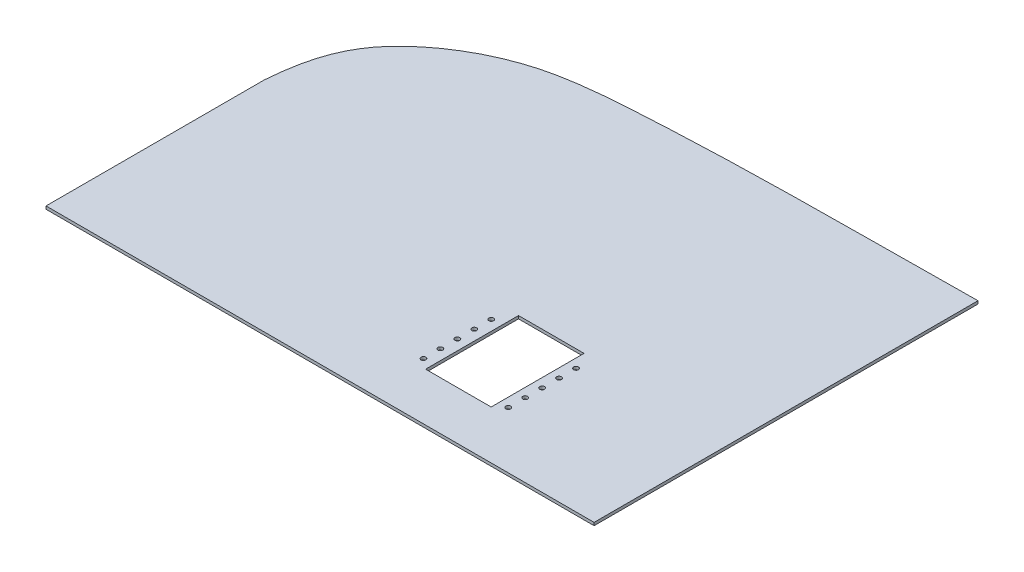
ISO-10303-21;
HEADER;
FILE_DESCRIPTION(('STEP AP214'),'2;1');
FILE_NAME('part.step','',(''),(''),'','','');
FILE_SCHEMA(('AUTOMOTIVE_DESIGN { 1 0 10303 214 1 1 1 1 }'));
ENDSEC;
DATA;
#1=APPLICATION_CONTEXT('core data for automotive mechanical design processes');
#2=APPLICATION_PROTOCOL_DEFINITION('international standard','automotive_design',2000,#1);
#3=PRODUCT_CONTEXT('',#1,'mechanical');
#4=PRODUCT('Part','Part','',(#3));
#5=PRODUCT_RELATED_PRODUCT_CATEGORY('part','',(#4));
#6=PRODUCT_DEFINITION_FORMATION('','',#4);
#7=PRODUCT_DEFINITION_CONTEXT('part definition',#1,'design');
#8=PRODUCT_DEFINITION('design','',#6,#7);
#9=PRODUCT_DEFINITION_SHAPE('','',#8);
#10=(LENGTH_UNIT() NAMED_UNIT(*) SI_UNIT(.MILLI.,.METRE.));
#11=(NAMED_UNIT(*) PLANE_ANGLE_UNIT() SI_UNIT($,.RADIAN.));
#12=(NAMED_UNIT(*) SI_UNIT($,.STERADIAN.) SOLID_ANGLE_UNIT());
#13=UNCERTAINTY_MEASURE_WITH_UNIT(LENGTH_MEASURE(1.E-05),#10,'distance_accuracy_value','');
#14=(GEOMETRIC_REPRESENTATION_CONTEXT(3) GLOBAL_UNCERTAINTY_ASSIGNED_CONTEXT((#13)) GLOBAL_UNIT_ASSIGNED_CONTEXT((#10,
#11,#12)) REPRESENTATION_CONTEXT('',''));
#15=CARTESIAN_POINT('',(0.,0.,0.));
#16=DIRECTION('',(0.,0.,1.));
#17=DIRECTION('',(1.,0.,0.));
#18=AXIS2_PLACEMENT_3D('',#15,#16,#17);
#19=CARTESIAN_POINT('',(76.0407582658623,2.4,-315.43813256716));
#20=DIRECTION('',(0.,1.,0.));
#21=DIRECTION('',(0.,0.,1.));
#22=AXIS2_PLACEMENT_3D('',#19,#20,#21);
#23=PLANE('',#22);
#24=CARTESIAN_POINT('',(38.6790277233677,2.4,-60.7));
#25=DIRECTION('',(0.,1.,0.));
#26=DIRECTION('',(0.,0.,1.));
#27=AXIS2_PLACEMENT_3D('',#24,#25,#26);
#28=CIRCLE('',#27,2.);
#29=CARTESIAN_POINT('',(38.6790277233677,2.4,-58.7));
#30=VERTEX_POINT('',#29);
#31=EDGE_CURVE('E251',#30,#30,#28,.T.);
#32=ORIENTED_EDGE('',*,*,#31,.F.);
#33=EDGE_LOOP('',(#32));
#34=FACE_BOUND('',#33,.T.);
#35=CARTESIAN_POINT('',(38.6790277233674,2.4,-88.7));
#36=DIRECTION('',(0.,1.,0.));
#37=DIRECTION('',(0.,0.,1.));
#38=AXIS2_PLACEMENT_3D('',#35,#36,#37);
#39=CIRCLE('',#38,2.);
#40=CARTESIAN_POINT('',(38.6790277233674,2.4,-86.7));
#41=VERTEX_POINT('',#40);
#42=EDGE_CURVE('E263',#41,#41,#39,.T.);
#43=ORIENTED_EDGE('',*,*,#42,.F.);
#44=EDGE_LOOP('',(#43));
#45=FACE_BOUND('',#44,.T.);
#46=CARTESIAN_POINT('',(108.679027723368,2.4,-60.7));
#47=DIRECTION('',(0.,1.,0.));
#48=DIRECTION('',(0.,0.,1.));
#49=AXIS2_PLACEMENT_3D('',#46,#47,#48);
#50=CIRCLE('',#49,2.00000000000001);
#51=CARTESIAN_POINT('',(108.679027723368,2.4,-58.7));
#52=VERTEX_POINT('',#51);
#53=EDGE_CURVE('E275',#52,#52,#50,.T.);
#54=ORIENTED_EDGE('',*,*,#53,.F.);
#55=EDGE_LOOP('',(#54));
#56=FACE_BOUND('',#55,.T.);
#57=CARTESIAN_POINT('',(108.679027723367,2.4,-88.7));
#58=DIRECTION('',(0.,1.,0.));
#59=DIRECTION('',(0.,0.,1.));
#60=AXIS2_PLACEMENT_3D('',#57,#58,#59);
#61=CIRCLE('',#60,2.);
#62=CARTESIAN_POINT('',(108.679027723367,2.4,-86.7));
#63=VERTEX_POINT('',#62);
#64=EDGE_CURVE('E287',#63,#63,#61,.T.);
#65=ORIENTED_EDGE('',*,*,#64,.F.);
#66=EDGE_LOOP('',(#65));
#67=FACE_BOUND('',#66,.T.);
#68=CARTESIAN_POINT('',(38.6790277233673,2.4,-102.7));
#69=DIRECTION('',(0.,1.,0.));
#70=DIRECTION('',(0.,0.,1.));
#71=AXIS2_PLACEMENT_3D('',#68,#69,#70);
#72=CIRCLE('',#71,2.);
#73=CARTESIAN_POINT('',(38.6790277233673,2.4,-100.7));
#74=VERTEX_POINT('',#73);
#75=EDGE_CURVE('E137',#74,#74,#72,.T.);
#76=ORIENTED_EDGE('',*,*,#75,.F.);
#77=EDGE_LOOP('',(#76));
#78=FACE_BOUND('',#77,.T.);
#79=DIRECTION('',(0.,0.,-1.));
#80=VECTOR('',#79,1.);
#81=CARTESIAN_POINT('',(226.279027723367,2.4,0.));
#82=LINE('',#81,#80);
#83=CARTESIAN_POINT('',(226.279027723367,2.4,0.));
#84=VERTEX_POINT('',#83);
#85=CARTESIAN_POINT('',(226.279027723367,2.4,-317.));
#86=VERTEX_POINT('',#85);
#87=EDGE_CURVE('E147',#84,#86,#82,.T.);
#88=ORIENTED_EDGE('',*,*,#87,.T.);
#89=CARTESIAN_POINT('',(226.279027723367,2.4,-317.));
#90=CARTESIAN_POINT('',(126.058596010829,2.4,-315.530489859332));
#91=CARTESIAN_POINT('',(25.9570834570145,2.4,-316.912644390666));
#92=CARTESIAN_POINT('',(-74.,2.4,-309.175657787283));
#93=B_SPLINE_CURVE_WITH_KNOTS('',3,(#89,#90,#91,#92),.UNSPECIFIED.,.F.,.F.,(4,4),(0.,1.),.UNSPECIFIED.);
#94=CARTESIAN_POINT('',(-74.,2.4,-309.175657787283));
#95=VERTEX_POINT('',#94);
#96=EDGE_CURVE('E150',#86,#95,#93,.T.);
#97=ORIENTED_EDGE('',*,*,#96,.T.);
#98=CARTESIAN_POINT('',(-74.,2.4,-309.175657787283));
#99=CARTESIAN_POINT('',(-89.4215417439998,2.4,-307.637409523307));
#100=CARTESIAN_POINT('',(-113.067752707542,2.4,-305.047150569867));
#101=CARTESIAN_POINT('',(-156.350341436039,2.4,-289.269961957736));
#102=CARTESIAN_POINT('',(-180.591001989476,2.4,-273.897889752811));
#103=CARTESIAN_POINT('',(-213.411911355581,2.4,-241.728935898293));
#104=CARTESIAN_POINT('',(-223.667205931551,2.4,-215.476583648526));
#105=CARTESIAN_POINT('',(-226.279027723367,2.4,-180.));
#106=B_SPLINE_CURVE_WITH_KNOTS('',3,(#98,#99,#100,#101,#102,#103,#104,#105),.UNSPECIFIED.,.F.,
.F.,(4,1,1,1,1,4),(0.,0.252038298692755,0.31225331059805,0.569939362557962,0.641935107147655,
1.),.UNSPECIFIED.);
#107=CARTESIAN_POINT('',(-226.279027723367,2.4,-180.));
#108=VERTEX_POINT('',#107);
#109=EDGE_CURVE('E156',#95,#108,#106,.T.);
#110=ORIENTED_EDGE('',*,*,#109,.T.);
#111=DIRECTION('',(0.,0.,1.));
#112=VECTOR('',#111,1.);
#113=CARTESIAN_POINT('',(-226.279027723367,2.4,0.));
#114=LINE('',#113,#112);
#115=CARTESIAN_POINT('',(-226.279027723367,2.4,0.));
#116=VERTEX_POINT('',#115);
#117=EDGE_CURVE('E349',#108,#116,#114,.T.);
#118=ORIENTED_EDGE('',*,*,#117,.T.);
#119=DIRECTION('',(1.,0.,0.));
#120=VECTOR('',#119,1.);
#121=CARTESIAN_POINT('',(-226.279027723367,2.4,0.));
#122=LINE('',#121,#120);
#123=EDGE_CURVE('E335',#116,#84,#122,.T.);
#124=ORIENTED_EDGE('',*,*,#123,.T.);
#125=EDGE_LOOP('',(#88,#97,#110,#118,#124));
#126=FACE_BOUND('',#125,.T.);
#127=DIRECTION('',(1.,0.,0.));
#128=VECTOR('',#127,1.);
#129=CARTESIAN_POINT('',(47.1790277233673,2.4,-40.));
#130=LINE('',#129,#128);
#131=CARTESIAN_POINT('',(47.1790277233673,2.4,-40.));
#132=VERTEX_POINT('',#131);
#133=CARTESIAN_POINT('',(101.279027723367,2.4,-40.));
#134=VERTEX_POINT('',#133);
#135=EDGE_CURVE('E116',#132,#134,#130,.T.);
#136=ORIENTED_EDGE('',*,*,#135,.F.);
#137=DIRECTION('',(0.,0.,1.));
#138=VECTOR('',#137,1.);
#139=CARTESIAN_POINT('',(47.1790277233673,2.4,-40.));
#140=LINE('',#139,#138);
#141=CARTESIAN_POINT('',(47.1790277233673,2.4,-116.7));
#142=VERTEX_POINT('',#141);
#143=EDGE_CURVE('E108',#142,#132,#140,.T.);
#144=ORIENTED_EDGE('',*,*,#143,.F.);
#145=DIRECTION('',(-1.,0.,0.));
#146=VECTOR('',#145,1.);
#147=CARTESIAN_POINT('',(47.1790277233673,2.4,-116.7));
#148=LINE('',#147,#146);
#149=CARTESIAN_POINT('',(101.279027723367,2.4,-116.7));
#150=VERTEX_POINT('',#149);
#151=EDGE_CURVE('E131',#150,#142,#148,.T.);
#152=ORIENTED_EDGE('',*,*,#151,.F.);
#153=DIRECTION('',(0.,0.,-1.));
#154=VECTOR('',#153,1.);
#155=CARTESIAN_POINT('',(101.279027723367,2.4,-40.));
#156=LINE('',#155,#154);
#157=EDGE_CURVE('E129',#134,#150,#156,.T.);
#158=ORIENTED_EDGE('',*,*,#157,.F.);
#159=EDGE_LOOP('',(#136,#144,#152,#158));
#160=FACE_BOUND('',#159,.T.);
#161=CARTESIAN_POINT('',(108.679027723367,2.4,-102.7));
#162=DIRECTION('',(0.,1.,0.));
#163=DIRECTION('',(0.,0.,1.));
#164=AXIS2_PLACEMENT_3D('',#161,#162,#163);
#165=CIRCLE('',#164,2.00000000000001);
#166=CARTESIAN_POINT('',(108.679027723367,2.4,-100.7));
#167=VERTEX_POINT('',#166);
#168=EDGE_CURVE('E293',#167,#167,#165,.T.);
#169=ORIENTED_EDGE('',*,*,#168,.F.);
#170=EDGE_LOOP('',(#169));
#171=FACE_BOUND('',#170,.T.);
#172=CARTESIAN_POINT('',(108.679027723368,2.4,-74.7));
#173=DIRECTION('',(0.,1.,0.));
#174=DIRECTION('',(0.,0.,1.));
#175=AXIS2_PLACEMENT_3D('',#172,#173,#174);
#176=CIRCLE('',#175,2.);
#177=CARTESIAN_POINT('',(108.679027723368,2.4,-72.7));
#178=VERTEX_POINT('',#177);
#179=EDGE_CURVE('E281',#178,#178,#176,.T.);
#180=ORIENTED_EDGE('',*,*,#179,.F.);
#181=EDGE_LOOP('',(#180));
#182=FACE_BOUND('',#181,.T.);
#183=CARTESIAN_POINT('',(108.679027723368,2.4,-46.7));
#184=DIRECTION('',(0.,1.,0.));
#185=DIRECTION('',(0.,0.,1.));
#186=AXIS2_PLACEMENT_3D('',#183,#184,#185);
#187=CIRCLE('',#186,2.00000000000001);
#188=CARTESIAN_POINT('',(108.679027723368,2.4,-44.7));
#189=VERTEX_POINT('',#188);
#190=EDGE_CURVE('E269',#189,#189,#187,.T.);
#191=ORIENTED_EDGE('',*,*,#190,.F.);
#192=EDGE_LOOP('',(#191));
#193=FACE_BOUND('',#192,.T.);
#194=CARTESIAN_POINT('',(38.6790277233676,2.4,-74.7));
#195=DIRECTION('',(0.,1.,0.));
#196=DIRECTION('',(0.,0.,1.));
#197=AXIS2_PLACEMENT_3D('',#194,#195,#196);
#198=CIRCLE('',#197,2.);
#199=CARTESIAN_POINT('',(38.6790277233676,2.4,-72.7));
#200=VERTEX_POINT('',#199);
#201=EDGE_CURVE('E257',#200,#200,#198,.T.);
#202=ORIENTED_EDGE('',*,*,#201,.F.);
#203=EDGE_LOOP('',(#202));
#204=FACE_BOUND('',#203,.T.);
#205=CARTESIAN_POINT('',(38.6790277233679,2.4,-46.7));
#206=DIRECTION('',(0.,1.,0.));
#207=DIRECTION('',(0.,0.,1.));
#208=AXIS2_PLACEMENT_3D('',#205,#206,#207);
#209=CIRCLE('',#208,2.);
#210=CARTESIAN_POINT('',(38.6790277233679,2.4,-44.7));
#211=VERTEX_POINT('',#210);
#212=EDGE_CURVE('E242',#211,#211,#209,.T.);
#213=ORIENTED_EDGE('',*,*,#212,.F.);
#214=EDGE_LOOP('',(#213));
#215=FACE_BOUND('',#214,.T.);
#216=ADVANCED_FACE('F37',(#34,#45,#56,#67,#78,#126,#160,#171,#182,#193,#204,#215),#23,.T.);
#217=CARTESIAN_POINT('',(76.0407582658623,0.,-315.43813256716));
#218=DIRECTION('',(0.,1.,0.));
#219=DIRECTION('',(0.,0.,1.));
#220=AXIS2_PLACEMENT_3D('',#217,#218,#219);
#221=PLANE('',#220);
#222=DIRECTION('',(0.,0.,-1.));
#223=VECTOR('',#222,1.);
#224=CARTESIAN_POINT('',(226.279027723367,0.,0.));
#225=LINE('',#224,#223);
#226=CARTESIAN_POINT('',(226.279027723367,0.,0.));
#227=VERTEX_POINT('',#226);
#228=CARTESIAN_POINT('',(226.279027723367,0.,-317.));
#229=VERTEX_POINT('',#228);
#230=EDGE_CURVE('E124',#227,#229,#225,.T.);
#231=ORIENTED_EDGE('',*,*,#230,.F.);
#232=DIRECTION('',(1.,0.,0.));
#233=VECTOR('',#232,1.);
#234=CARTESIAN_POINT('',(-226.279027723367,0.,0.));
#235=LINE('',#234,#233);
#236=CARTESIAN_POINT('',(-226.279027723367,0.,0.));
#237=VERTEX_POINT('',#236);
#238=EDGE_CURVE('E151',#237,#227,#235,.T.);
#239=ORIENTED_EDGE('',*,*,#238,.F.);
#240=DIRECTION('',(0.,0.,1.));
#241=VECTOR('',#240,1.);
#242=CARTESIAN_POINT('',(-226.279027723367,0.,0.));
#243=LINE('',#242,#241);
#244=CARTESIAN_POINT('',(-226.279027723367,0.,-180.));
#245=VERTEX_POINT('',#244);
#246=EDGE_CURVE('E365',#245,#237,#243,.T.);
#247=ORIENTED_EDGE('',*,*,#246,.F.);
#248=CARTESIAN_POINT('',(-74.,0.,-309.175657787283));
#249=CARTESIAN_POINT('',(-89.4215417439998,0.,-307.637409523307));
#250=CARTESIAN_POINT('',(-113.067752707542,0.,-305.047150569867));
#251=CARTESIAN_POINT('',(-156.350341436039,0.,-289.269961957736));
#252=CARTESIAN_POINT('',(-180.591001989476,0.,-273.897889752811));
#253=CARTESIAN_POINT('',(-213.411911355581,0.,-241.728935898293));
#254=CARTESIAN_POINT('',(-223.667205931551,0.,-215.476583648526));
#255=CARTESIAN_POINT('',(-226.279027723367,0.,-180.));
#256=B_SPLINE_CURVE_WITH_KNOTS('',3,(#248,#249,#250,#251,#252,#253,#254,#255),.UNSPECIFIED.,.F.,
.F.,(4,1,1,1,1,4),(0.,0.252038298692755,0.31225331059805,0.569939362557962,0.641935107147655,
1.),.UNSPECIFIED.);
#257=CARTESIAN_POINT('',(-74.,0.,-309.175657787283));
#258=VERTEX_POINT('',#257);
#259=EDGE_CURVE('E358',#258,#245,#256,.T.);
#260=ORIENTED_EDGE('',*,*,#259,.F.);
#261=CARTESIAN_POINT('',(226.279027723367,0.,-317.));
#262=CARTESIAN_POINT('',(126.058596010829,0.,-315.530489859332));
#263=CARTESIAN_POINT('',(25.9570834570145,0.,-316.912644390666));
#264=CARTESIAN_POINT('',(-74.,0.,-309.175657787283));
#265=B_SPLINE_CURVE_WITH_KNOTS('',3,(#261,#262,#263,#264),.UNSPECIFIED.,.F.,.F.,(4,4),(0.,1.),.UNSPECIFIED.);
#266=EDGE_CURVE('E341',#229,#258,#265,.T.);
#267=ORIENTED_EDGE('',*,*,#266,.F.);
#268=EDGE_LOOP('',(#231,#239,#247,#260,#267));
#269=FACE_BOUND('',#268,.T.);
#270=DIRECTION('',(0.,0.,1.));
#271=VECTOR('',#270,1.);
#272=CARTESIAN_POINT('',(47.1790277233673,0.,-40.));
#273=LINE('',#272,#271);
#274=CARTESIAN_POINT('',(47.1790277233673,0.,-116.7));
#275=VERTEX_POINT('',#274);
#276=CARTESIAN_POINT('',(47.1790277233673,0.,-40.));
#277=VERTEX_POINT('',#276);
#278=EDGE_CURVE('E60',#275,#277,#273,.T.);
#279=ORIENTED_EDGE('',*,*,#278,.T.);
#280=DIRECTION('',(1.,0.,0.));
#281=VECTOR('',#280,1.);
#282=CARTESIAN_POINT('',(47.1790277233673,0.,-40.));
#283=LINE('',#282,#281);
#284=CARTESIAN_POINT('',(101.279027723367,0.,-40.));
#285=VERTEX_POINT('',#284);
#286=EDGE_CURVE('E123',#277,#285,#283,.T.);
#287=ORIENTED_EDGE('',*,*,#286,.T.);
#288=DIRECTION('',(0.,0.,-1.));
#289=VECTOR('',#288,1.);
#290=CARTESIAN_POINT('',(101.279027723367,0.,-40.));
#291=LINE('',#290,#289);
#292=CARTESIAN_POINT('',(101.279027723367,0.,-116.7));
#293=VERTEX_POINT('',#292);
#294=EDGE_CURVE('E139',#285,#293,#291,.T.);
#295=ORIENTED_EDGE('',*,*,#294,.T.);
#296=DIRECTION('',(-1.,0.,0.));
#297=VECTOR('',#296,1.);
#298=CARTESIAN_POINT('',(47.1790277233673,0.,-116.7));
#299=LINE('',#298,#297);
#300=EDGE_CURVE('E117',#293,#275,#299,.T.);
#301=ORIENTED_EDGE('',*,*,#300,.T.);
#302=EDGE_LOOP('',(#279,#287,#295,#301));
#303=FACE_BOUND('',#302,.T.);
#304=CARTESIAN_POINT('',(38.6790277233673,0.,-102.7));
#305=DIRECTION('',(0.,1.,0.));
#306=DIRECTION('',(0.,0.,1.));
#307=AXIS2_PLACEMENT_3D('',#304,#305,#306);
#308=CIRCLE('',#307,2.);
#309=CARTESIAN_POINT('',(38.6790277233673,0.,-100.7));
#310=VERTEX_POINT('',#309);
#311=EDGE_CURVE('E296',#310,#310,#308,.T.);
#312=ORIENTED_EDGE('',*,*,#311,.T.);
#313=EDGE_LOOP('',(#312));
#314=FACE_BOUND('',#313,.T.);
#315=CARTESIAN_POINT('',(108.679027723367,0.,-102.7));
#316=DIRECTION('',(0.,1.,0.));
#317=DIRECTION('',(0.,0.,1.));
#318=AXIS2_PLACEMENT_3D('',#315,#316,#317);
#319=CIRCLE('',#318,2.00000000000001);
#320=CARTESIAN_POINT('',(108.679027723367,0.,-100.7));
#321=VERTEX_POINT('',#320);
#322=EDGE_CURVE('E290',#321,#321,#319,.T.);
#323=ORIENTED_EDGE('',*,*,#322,.T.);
#324=EDGE_LOOP('',(#323));
#325=FACE_BOUND('',#324,.T.);
#326=CARTESIAN_POINT('',(108.679027723367,0.,-88.7));
#327=DIRECTION('',(0.,1.,0.));
#328=DIRECTION('',(0.,0.,1.));
#329=AXIS2_PLACEMENT_3D('',#326,#327,#328);
#330=CIRCLE('',#329,2.);
#331=CARTESIAN_POINT('',(108.679027723367,0.,-86.7));
#332=VERTEX_POINT('',#331);
#333=EDGE_CURVE('E284',#332,#332,#330,.T.);
#334=ORIENTED_EDGE('',*,*,#333,.T.);
#335=EDGE_LOOP('',(#334));
#336=FACE_BOUND('',#335,.T.);
#337=CARTESIAN_POINT('',(108.679027723368,0.,-74.7));
#338=DIRECTION('',(0.,1.,0.));
#339=DIRECTION('',(0.,0.,1.));
#340=AXIS2_PLACEMENT_3D('',#337,#338,#339);
#341=CIRCLE('',#340,2.);
#342=CARTESIAN_POINT('',(108.679027723368,0.,-72.7));
#343=VERTEX_POINT('',#342);
#344=EDGE_CURVE('E278',#343,#343,#341,.T.);
#345=ORIENTED_EDGE('',*,*,#344,.T.);
#346=EDGE_LOOP('',(#345));
#347=FACE_BOUND('',#346,.T.);
#348=CARTESIAN_POINT('',(108.679027723368,0.,-60.7));
#349=DIRECTION('',(0.,1.,0.));
#350=DIRECTION('',(0.,0.,1.));
#351=AXIS2_PLACEMENT_3D('',#348,#349,#350);
#352=CIRCLE('',#351,2.00000000000001);
#353=CARTESIAN_POINT('',(108.679027723368,0.,-58.7));
#354=VERTEX_POINT('',#353);
#355=EDGE_CURVE('E272',#354,#354,#352,.T.);
#356=ORIENTED_EDGE('',*,*,#355,.T.);
#357=EDGE_LOOP('',(#356));
#358=FACE_BOUND('',#357,.T.);
#359=CARTESIAN_POINT('',(108.679027723368,0.,-46.7));
#360=DIRECTION('',(0.,1.,0.));
#361=DIRECTION('',(0.,0.,1.));
#362=AXIS2_PLACEMENT_3D('',#359,#360,#361);
#363=CIRCLE('',#362,2.00000000000001);
#364=CARTESIAN_POINT('',(108.679027723368,0.,-44.7));
#365=VERTEX_POINT('',#364);
#366=EDGE_CURVE('E266',#365,#365,#363,.T.);
#367=ORIENTED_EDGE('',*,*,#366,.T.);
#368=EDGE_LOOP('',(#367));
#369=FACE_BOUND('',#368,.T.);
#370=CARTESIAN_POINT('',(38.6790277233674,0.,-88.7));
#371=DIRECTION('',(0.,1.,0.));
#372=DIRECTION('',(0.,0.,1.));
#373=AXIS2_PLACEMENT_3D('',#370,#371,#372);
#374=CIRCLE('',#373,2.);
#375=CARTESIAN_POINT('',(38.6790277233674,0.,-86.7));
#376=VERTEX_POINT('',#375);
#377=EDGE_CURVE('E260',#376,#376,#374,.T.);
#378=ORIENTED_EDGE('',*,*,#377,.T.);
#379=EDGE_LOOP('',(#378));
#380=FACE_BOUND('',#379,.T.);
#381=CARTESIAN_POINT('',(38.6790277233676,0.,-74.7));
#382=DIRECTION('',(0.,1.,0.));
#383=DIRECTION('',(0.,0.,1.));
#384=AXIS2_PLACEMENT_3D('',#381,#382,#383);
#385=CIRCLE('',#384,2.);
#386=CARTESIAN_POINT('',(38.6790277233676,0.,-72.7));
#387=VERTEX_POINT('',#386);
#388=EDGE_CURVE('E254',#387,#387,#385,.T.);
#389=ORIENTED_EDGE('',*,*,#388,.T.);
#390=EDGE_LOOP('',(#389));
#391=FACE_BOUND('',#390,.T.);
#392=CARTESIAN_POINT('',(38.6790277233677,0.,-60.7));
#393=DIRECTION('',(0.,1.,0.));
#394=DIRECTION('',(0.,0.,1.));
#395=AXIS2_PLACEMENT_3D('',#392,#393,#394);
#396=CIRCLE('',#395,2.);
#397=CARTESIAN_POINT('',(38.6790277233677,0.,-58.7));
#398=VERTEX_POINT('',#397);
#399=EDGE_CURVE('E248',#398,#398,#396,.T.);
#400=ORIENTED_EDGE('',*,*,#399,.T.);
#401=EDGE_LOOP('',(#400));
#402=FACE_BOUND('',#401,.T.);
#403=CARTESIAN_POINT('',(38.6790277233679,0.,-46.7));
#404=DIRECTION('',(0.,1.,0.));
#405=DIRECTION('',(0.,0.,1.));
#406=AXIS2_PLACEMENT_3D('',#403,#404,#405);
#407=CIRCLE('',#406,2.);
#408=CARTESIAN_POINT('',(38.6790277233679,0.,-44.7));
#409=VERTEX_POINT('',#408);
#410=EDGE_CURVE('E245',#409,#409,#407,.T.);
#411=ORIENTED_EDGE('',*,*,#410,.T.);
#412=EDGE_LOOP('',(#411));
#413=FACE_BOUND('',#412,.T.);
#414=ADVANCED_FACE('F180',(#269,#303,#314,#325,#336,#347,#358,#369,#380,#391,#402,#413),#221,.F.);
#415=CARTESIAN_POINT('',(226.279027723367,2.4,0.));
#416=DIRECTION('',(-1.,0.,0.));
#417=DIRECTION('',(0.,0.,1.));
#418=AXIS2_PLACEMENT_3D('',#415,#416,#417);
#419=PLANE('',#418);
#420=ORIENTED_EDGE('',*,*,#230,.T.);
#421=DIRECTION('',(0.,-1.,0.));
#422=VECTOR('',#421,1.);
#423=CARTESIAN_POINT('',(226.279027723367,2.4,-317.));
#424=LINE('',#423,#422);
#425=EDGE_CURVE('E11',#86,#229,#424,.T.);
#426=ORIENTED_EDGE('',*,*,#425,.F.);
#427=ORIENTED_EDGE('',*,*,#87,.F.);
#428=DIRECTION('',(0.,-1.,0.));
#429=VECTOR('',#428,1.);
#430=CARTESIAN_POINT('',(226.279027723367,2.4,0.));
#431=LINE('',#430,#429);
#432=EDGE_CURVE('E351',#84,#227,#431,.T.);
#433=ORIENTED_EDGE('',*,*,#432,.T.);
#434=EDGE_LOOP('',(#420,#426,#427,#433));
#435=FACE_BOUND('',#434,.T.);
#436=ADVANCED_FACE('F39',(#435),#419,.F.);
#437=DIRECTION('',(0.,-1.,0.));
#438=VECTOR('',#437,1.);
#439=SURFACE_OF_LINEAR_EXTRUSION('',#93,#438);
#440=ORIENTED_EDGE('',*,*,#266,.T.);
#441=DIRECTION('',(0.,-1.,0.));
#442=VECTOR('',#441,1.);
#443=CARTESIAN_POINT('',(-74.,2.4,-309.175657787283));
#444=LINE('',#443,#442);
#445=EDGE_CURVE('E45',#95,#258,#444,.T.);
#446=ORIENTED_EDGE('',*,*,#445,.F.);
#447=ORIENTED_EDGE('',*,*,#96,.F.);
#448=ORIENTED_EDGE('',*,*,#425,.T.);
#449=EDGE_LOOP('',(#440,#446,#447,#448));
#450=FACE_BOUND('',#449,.T.);
#451=ADVANCED_FACE('F164',(#450),#439,.F.);
#452=DIRECTION('',(0.,-1.,0.));
#453=VECTOR('',#452,1.);
#454=SURFACE_OF_LINEAR_EXTRUSION('',#106,#453);
#455=ORIENTED_EDGE('',*,*,#259,.T.);
#456=DIRECTION('',(0.,-1.,0.));
#457=VECTOR('',#456,1.);
#458=CARTESIAN_POINT('',(-226.279027723367,2.4,-180.));
#459=LINE('',#458,#457);
#460=EDGE_CURVE('E345',#108,#245,#459,.T.);
#461=ORIENTED_EDGE('',*,*,#460,.F.);
#462=ORIENTED_EDGE('',*,*,#109,.F.);
#463=ORIENTED_EDGE('',*,*,#445,.T.);
#464=EDGE_LOOP('',(#455,#461,#462,#463));
#465=FACE_BOUND('',#464,.T.);
#466=ADVANCED_FACE('F167',(#465),#454,.F.);
#467=CARTESIAN_POINT('',(-226.279027723367,2.4,0.));
#468=DIRECTION('',(1.,0.,0.));
#469=DIRECTION('',(0.,0.,-1.));
#470=AXIS2_PLACEMENT_3D('',#467,#468,#469);
#471=PLANE('',#470);
#472=ORIENTED_EDGE('',*,*,#246,.T.);
#473=DIRECTION('',(0.,-1.,0.));
#474=VECTOR('',#473,1.);
#475=CARTESIAN_POINT('',(-226.279027723367,2.4,0.));
#476=LINE('',#475,#474);
#477=EDGE_CURVE('E372',#116,#237,#476,.T.);
#478=ORIENTED_EDGE('',*,*,#477,.F.);
#479=ORIENTED_EDGE('',*,*,#117,.F.);
#480=ORIENTED_EDGE('',*,*,#460,.T.);
#481=EDGE_LOOP('',(#472,#478,#479,#480));
#482=FACE_BOUND('',#481,.T.);
#483=ADVANCED_FACE('F171',(#482),#471,.F.);
#484=CARTESIAN_POINT('',(-226.279027723367,2.4,0.));
#485=DIRECTION('',(0.,0.,-1.));
#486=DIRECTION('',(-1.,0.,0.));
#487=AXIS2_PLACEMENT_3D('',#484,#485,#486);
#488=PLANE('',#487);
#489=ORIENTED_EDGE('',*,*,#238,.T.);
#490=ORIENTED_EDGE('',*,*,#432,.F.);
#491=ORIENTED_EDGE('',*,*,#123,.F.);
#492=ORIENTED_EDGE('',*,*,#477,.T.);
#493=EDGE_LOOP('',(#489,#490,#491,#492));
#494=FACE_BOUND('',#493,.T.);
#495=ADVANCED_FACE('F175',(#494),#488,.F.);
#496=CARTESIAN_POINT('',(47.1790277233673,2.4,-40.));
#497=DIRECTION('',(1.,0.,0.));
#498=DIRECTION('',(0.,0.,-1.));
#499=AXIS2_PLACEMENT_3D('',#496,#497,#498);
#500=PLANE('',#499);
#501=ORIENTED_EDGE('',*,*,#278,.F.);
#502=DIRECTION('',(0.,-1.,0.));
#503=VECTOR('',#502,1.);
#504=CARTESIAN_POINT('',(47.1790277233673,2.4,-116.7));
#505=LINE('',#504,#503);
#506=EDGE_CURVE('E112',#142,#275,#505,.T.);
#507=ORIENTED_EDGE('',*,*,#506,.F.);
#508=ORIENTED_EDGE('',*,*,#143,.T.);
#509=DIRECTION('',(0.,-1.,0.));
#510=VECTOR('',#509,1.);
#511=CARTESIAN_POINT('',(47.1790277233673,2.4,-40.));
#512=LINE('',#511,#510);
#513=EDGE_CURVE('E111',#132,#277,#512,.T.);
#514=ORIENTED_EDGE('',*,*,#513,.T.);
#515=EDGE_LOOP('',(#501,#507,#508,#514));
#516=FACE_BOUND('',#515,.T.);
#517=ADVANCED_FACE('F110',(#516),#500,.T.);
#518=CARTESIAN_POINT('',(47.1790277233673,2.4,-40.));
#519=DIRECTION('',(0.,0.,-1.));
#520=DIRECTION('',(-1.,0.,0.));
#521=AXIS2_PLACEMENT_3D('',#518,#519,#520);
#522=PLANE('',#521);
#523=ORIENTED_EDGE('',*,*,#286,.F.);
#524=ORIENTED_EDGE('',*,*,#513,.F.);
#525=ORIENTED_EDGE('',*,*,#135,.T.);
#526=DIRECTION('',(0.,-1.,0.));
#527=VECTOR('',#526,1.);
#528=CARTESIAN_POINT('',(101.279027723367,2.4,-40.));
#529=LINE('',#528,#527);
#530=EDGE_CURVE('E125',#134,#285,#529,.T.);
#531=ORIENTED_EDGE('',*,*,#530,.T.);
#532=EDGE_LOOP('',(#523,#524,#525,#531));
#533=FACE_BOUND('',#532,.T.);
#534=ADVANCED_FACE('F120',(#533),#522,.T.);
#535=CARTESIAN_POINT('',(101.279027723367,2.4,-40.));
#536=DIRECTION('',(-1.,0.,0.));
#537=DIRECTION('',(0.,0.,1.));
#538=AXIS2_PLACEMENT_3D('',#535,#536,#537);
#539=PLANE('',#538);
#540=ORIENTED_EDGE('',*,*,#294,.F.);
#541=ORIENTED_EDGE('',*,*,#530,.F.);
#542=ORIENTED_EDGE('',*,*,#157,.T.);
#543=DIRECTION('',(0.,-1.,0.));
#544=VECTOR('',#543,1.);
#545=CARTESIAN_POINT('',(101.279027723367,2.4,-116.7));
#546=LINE('',#545,#544);
#547=EDGE_CURVE('E52',#150,#293,#546,.T.);
#548=ORIENTED_EDGE('',*,*,#547,.T.);
#549=EDGE_LOOP('',(#540,#541,#542,#548));
#550=FACE_BOUND('',#549,.T.);
#551=ADVANCED_FACE('F191',(#550),#539,.T.);
#552=CARTESIAN_POINT('',(47.1790277233673,2.4,-116.7));
#553=DIRECTION('',(0.,0.,1.));
#554=DIRECTION('',(1.,0.,0.));
#555=AXIS2_PLACEMENT_3D('',#552,#553,#554);
#556=PLANE('',#555);
#557=ORIENTED_EDGE('',*,*,#300,.F.);
#558=ORIENTED_EDGE('',*,*,#547,.F.);
#559=ORIENTED_EDGE('',*,*,#151,.T.);
#560=ORIENTED_EDGE('',*,*,#506,.T.);
#561=EDGE_LOOP('',(#557,#558,#559,#560));
#562=FACE_BOUND('',#561,.T.);
#563=ADVANCED_FACE('F194',(#562),#556,.T.);
#564=CARTESIAN_POINT('',(38.6790277233673,2.4,-102.7));
#565=DIRECTION('',(0.,-1.,0.));
#566=DIRECTION('',(0.,0.,-1.));
#567=AXIS2_PLACEMENT_3D('',#564,#565,#566);
#568=CYLINDRICAL_SURFACE('',#567,2.);
#569=ORIENTED_EDGE('',*,*,#75,.T.);
#570=EDGE_LOOP('',(#569));
#571=FACE_BOUND('',#570,.T.);
#572=ORIENTED_EDGE('',*,*,#311,.F.);
#573=EDGE_LOOP('',(#572));
#574=FACE_BOUND('',#573,.T.);
#575=ADVANCED_FACE('F198',(#571,#574),#568,.F.);
#576=CARTESIAN_POINT('',(108.679027723367,2.4,-102.7));
#577=DIRECTION('',(0.,-1.,0.));
#578=DIRECTION('',(0.,0.,-1.));
#579=AXIS2_PLACEMENT_3D('',#576,#577,#578);
#580=CYLINDRICAL_SURFACE('',#579,2.00000000000001);
#581=ORIENTED_EDGE('',*,*,#168,.T.);
#582=EDGE_LOOP('',(#581));
#583=FACE_BOUND('',#582,.T.);
#584=ORIENTED_EDGE('',*,*,#322,.F.);
#585=EDGE_LOOP('',(#584));
#586=FACE_BOUND('',#585,.T.);
#587=ADVANCED_FACE('F201',(#583,#586),#580,.F.);
#588=CARTESIAN_POINT('',(108.679027723367,2.4,-88.7));
#589=DIRECTION('',(0.,-1.,0.));
#590=DIRECTION('',(0.,0.,-1.));
#591=AXIS2_PLACEMENT_3D('',#588,#589,#590);
#592=CYLINDRICAL_SURFACE('',#591,2.);
#593=ORIENTED_EDGE('',*,*,#64,.T.);
#594=EDGE_LOOP('',(#593));
#595=FACE_BOUND('',#594,.T.);
#596=ORIENTED_EDGE('',*,*,#333,.F.);
#597=EDGE_LOOP('',(#596));
#598=FACE_BOUND('',#597,.T.);
#599=ADVANCED_FACE('F205',(#595,#598),#592,.F.);
#600=CARTESIAN_POINT('',(108.679027723368,2.4,-74.7));
#601=DIRECTION('',(0.,-1.,0.));
#602=DIRECTION('',(0.,0.,-1.));
#603=AXIS2_PLACEMENT_3D('',#600,#601,#602);
#604=CYLINDRICAL_SURFACE('',#603,2.);
#605=ORIENTED_EDGE('',*,*,#179,.T.);
#606=EDGE_LOOP('',(#605));
#607=FACE_BOUND('',#606,.T.);
#608=ORIENTED_EDGE('',*,*,#344,.F.);
#609=EDGE_LOOP('',(#608));
#610=FACE_BOUND('',#609,.T.);
#611=ADVANCED_FACE('F209',(#607,#610),#604,.F.);
#612=CARTESIAN_POINT('',(108.679027723368,2.4,-60.7));
#613=DIRECTION('',(0.,-1.,0.));
#614=DIRECTION('',(0.,0.,-1.));
#615=AXIS2_PLACEMENT_3D('',#612,#613,#614);
#616=CYLINDRICAL_SURFACE('',#615,2.00000000000001);
#617=ORIENTED_EDGE('',*,*,#53,.T.);
#618=EDGE_LOOP('',(#617));
#619=FACE_BOUND('',#618,.T.);
#620=ORIENTED_EDGE('',*,*,#355,.F.);
#621=EDGE_LOOP('',(#620));
#622=FACE_BOUND('',#621,.T.);
#623=ADVANCED_FACE('F213',(#619,#622),#616,.F.);
#624=CARTESIAN_POINT('',(108.679027723368,2.4,-46.7));
#625=DIRECTION('',(0.,-1.,0.));
#626=DIRECTION('',(0.,0.,-1.));
#627=AXIS2_PLACEMENT_3D('',#624,#625,#626);
#628=CYLINDRICAL_SURFACE('',#627,2.00000000000001);
#629=ORIENTED_EDGE('',*,*,#190,.T.);
#630=EDGE_LOOP('',(#629));
#631=FACE_BOUND('',#630,.T.);
#632=ORIENTED_EDGE('',*,*,#366,.F.);
#633=EDGE_LOOP('',(#632));
#634=FACE_BOUND('',#633,.T.);
#635=ADVANCED_FACE('F217',(#631,#634),#628,.F.);
#636=CARTESIAN_POINT('',(38.6790277233674,2.4,-88.7));
#637=DIRECTION('',(0.,-1.,0.));
#638=DIRECTION('',(0.,0.,-1.));
#639=AXIS2_PLACEMENT_3D('',#636,#637,#638);
#640=CYLINDRICAL_SURFACE('',#639,2.);
#641=ORIENTED_EDGE('',*,*,#42,.T.);
#642=EDGE_LOOP('',(#641));
#643=FACE_BOUND('',#642,.T.);
#644=ORIENTED_EDGE('',*,*,#377,.F.);
#645=EDGE_LOOP('',(#644));
#646=FACE_BOUND('',#645,.T.);
#647=ADVANCED_FACE('F221',(#643,#646),#640,.F.);
#648=CARTESIAN_POINT('',(38.6790277233676,2.4,-74.7));
#649=DIRECTION('',(0.,-1.,0.));
#650=DIRECTION('',(0.,0.,-1.));
#651=AXIS2_PLACEMENT_3D('',#648,#649,#650);
#652=CYLINDRICAL_SURFACE('',#651,2.);
#653=ORIENTED_EDGE('',*,*,#201,.T.);
#654=EDGE_LOOP('',(#653));
#655=FACE_BOUND('',#654,.T.);
#656=ORIENTED_EDGE('',*,*,#388,.F.);
#657=EDGE_LOOP('',(#656));
#658=FACE_BOUND('',#657,.T.);
#659=ADVANCED_FACE('F225',(#655,#658),#652,.F.);
#660=CARTESIAN_POINT('',(38.6790277233677,2.4,-60.7));
#661=DIRECTION('',(0.,-1.,0.));
#662=DIRECTION('',(0.,0.,-1.));
#663=AXIS2_PLACEMENT_3D('',#660,#661,#662);
#664=CYLINDRICAL_SURFACE('',#663,2.);
#665=ORIENTED_EDGE('',*,*,#31,.T.);
#666=EDGE_LOOP('',(#665));
#667=FACE_BOUND('',#666,.T.);
#668=ORIENTED_EDGE('',*,*,#399,.F.);
#669=EDGE_LOOP('',(#668));
#670=FACE_BOUND('',#669,.T.);
#671=ADVANCED_FACE('F229',(#667,#670),#664,.F.);
#672=CARTESIAN_POINT('',(38.6790277233679,2.4,-46.7));
#673=DIRECTION('',(0.,-1.,0.));
#674=DIRECTION('',(0.,0.,-1.));
#675=AXIS2_PLACEMENT_3D('',#672,#673,#674);
#676=CYLINDRICAL_SURFACE('',#675,2.);
#677=ORIENTED_EDGE('',*,*,#212,.T.);
#678=EDGE_LOOP('',(#677));
#679=FACE_BOUND('',#678,.T.);
#680=ORIENTED_EDGE('',*,*,#410,.F.);
#681=EDGE_LOOP('',(#680));
#682=FACE_BOUND('',#681,.T.);
#683=ADVANCED_FACE('F233',(#679,#682),#676,.F.);
#684=CLOSED_SHELL('',(#216,#414,#436,#451,#466,#483,#495,#517,#534,#551,#563,#575,#587,#599,
#611,#623,#635,#647,#659,#671,#683));
#685=MANIFOLD_SOLID_BREP('B2',#684);
#686=ADVANCED_BREP_SHAPE_REPRESENTATION('',(#18,#685),#14);
#687=SHAPE_DEFINITION_REPRESENTATION(#9,#686);
ENDSEC;
END-ISO-10303-21;
